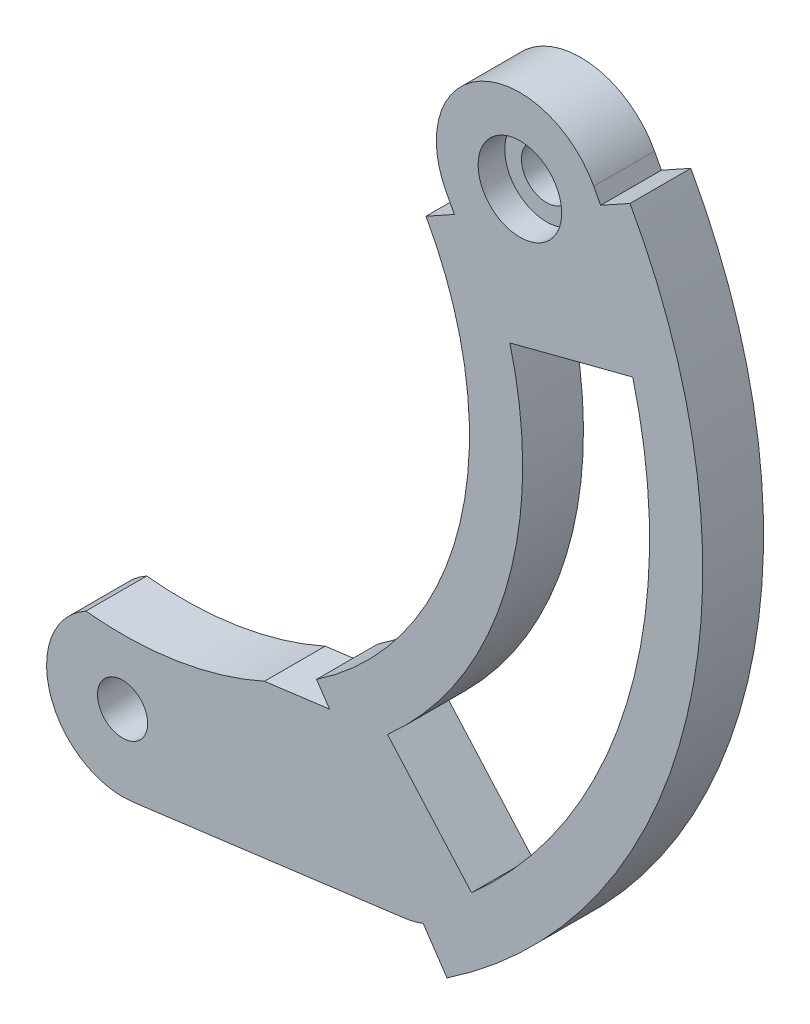
ISO-10303-21;
HEADER;
FILE_DESCRIPTION(('STEP AP214'),'2;1');
FILE_NAME('part.step','',(''),(''),'','','');
FILE_SCHEMA(('AUTOMOTIVE_DESIGN { 1 0 10303 214 1 1 1 1 }'));
ENDSEC;
DATA;
#1=APPLICATION_CONTEXT('core data for automotive mechanical design processes');
#2=APPLICATION_PROTOCOL_DEFINITION('international standard','automotive_design',2000,#1);
#3=PRODUCT_CONTEXT('',#1,'mechanical');
#4=PRODUCT('Part','Part','',(#3));
#5=PRODUCT_RELATED_PRODUCT_CATEGORY('part','',(#4));
#6=PRODUCT_DEFINITION_FORMATION('','',#4);
#7=PRODUCT_DEFINITION_CONTEXT('part definition',#1,'design');
#8=PRODUCT_DEFINITION('design','',#6,#7);
#9=PRODUCT_DEFINITION_SHAPE('','',#8);
#10=(LENGTH_UNIT() NAMED_UNIT(*) SI_UNIT(.MILLI.,.METRE.));
#11=(NAMED_UNIT(*) PLANE_ANGLE_UNIT() SI_UNIT($,.RADIAN.));
#12=(NAMED_UNIT(*) SI_UNIT($,.STERADIAN.) SOLID_ANGLE_UNIT());
#13=UNCERTAINTY_MEASURE_WITH_UNIT(LENGTH_MEASURE(1.E-05),#10,'distance_accuracy_value','');
#14=(GEOMETRIC_REPRESENTATION_CONTEXT(3) GLOBAL_UNCERTAINTY_ASSIGNED_CONTEXT((#13)) GLOBAL_UNIT_ASSIGNED_CONTEXT((#10,
#11,#12)) REPRESENTATION_CONTEXT('',''));
#15=CARTESIAN_POINT('',(0.,0.,0.));
#16=DIRECTION('',(0.,0.,1.));
#17=DIRECTION('',(1.,0.,0.));
#18=AXIS2_PLACEMENT_3D('',#15,#16,#17);
#19=CARTESIAN_POINT('',(52.2872053428289,31.4173225695133,8.1));
#20=DIRECTION('',(0.,0.,-1.));
#21=DIRECTION('',(-1.,0.,0.));
#22=AXIS2_PLACEMENT_3D('',#19,#20,#21);
#23=CYLINDRICAL_SURFACE('',#22,3.3);
#24=CARTESIAN_POINT('',(52.2872053428289,31.4173225695133,1.25));
#25=DIRECTION('',(0.,0.,1.));
#26=DIRECTION('',(1.,0.,0.));
#27=AXIS2_PLACEMENT_3D('',#24,#25,#26);
#28=CIRCLE('',#27,3.3);
#29=CARTESIAN_POINT('',(55.5872053428289,31.4173225695133,1.25));
#30=VERTEX_POINT('',#29);
#31=EDGE_CURVE('E299',#30,#30,#28,.T.);
#32=ORIENTED_EDGE('',*,*,#31,.F.);
#33=EDGE_LOOP('',(#32));
#34=FACE_BOUND('',#33,.T.);
#35=CARTESIAN_POINT('',(52.2872053428289,31.4173225695133,4.5));
#36=DIRECTION('',(0.,0.,1.));
#37=DIRECTION('',(1.,0.,0.));
#38=AXIS2_PLACEMENT_3D('',#35,#36,#37);
#39=CIRCLE('',#38,3.3);
#40=CARTESIAN_POINT('',(55.5872053428289,31.4173225695133,4.5));
#41=VERTEX_POINT('',#40);
#42=EDGE_CURVE('E303',#41,#41,#39,.T.);
#43=ORIENTED_EDGE('',*,*,#42,.T.);
#44=EDGE_LOOP('',(#43));
#45=FACE_BOUND('',#44,.T.);
#46=ADVANCED_FACE('F39',(#34,#45),#23,.F.);
#47=CARTESIAN_POINT('',(0.,0.,8.));
#48=DIRECTION('',(0.,0.,-1.));
#49=DIRECTION('',(-1.,0.,0.));
#50=AXIS2_PLACEMENT_3D('',#47,#48,#49);
#51=PLANE('',#50);
#52=CARTESIAN_POINT('',(52.2872053428289,31.4173225695133,8.));
#53=DIRECTION('',(0.,0.,-1.));
#54=DIRECTION('',(-1.,0.,0.));
#55=AXIS2_PLACEMENT_3D('',#52,#53,#54);
#56=CIRCLE('',#55,5.5);
#57=CARTESIAN_POINT('',(46.7872053428289,31.4173225695133,8.));
#58=VERTEX_POINT('',#57);
#59=EDGE_CURVE('E305',#58,#58,#56,.F.);
#60=ORIENTED_EDGE('',*,*,#59,.F.);
#61=EDGE_LOOP('',(#60));
#62=FACE_BOUND('',#61,.T.);
#63=CARTESIAN_POINT('',(0.,-54.,8.));
#64=DIRECTION('',(0.,0.,-1.));
#65=DIRECTION('',(-1.,0.,0.));
#66=AXIS2_PLACEMENT_3D('',#63,#64,#65);
#67=CIRCLE('',#66,3.3);
#68=CARTESIAN_POINT('',(-3.3,-54.,8.));
#69=VERTEX_POINT('',#68);
#70=EDGE_CURVE('E180',#69,#69,#67,.F.);
#71=ORIENTED_EDGE('',*,*,#70,.F.);
#72=EDGE_LOOP('',(#71));
#73=FACE_BOUND('',#72,.T.);
#74=CARTESIAN_POINT('',(0.,0.,8.));
#75=DIRECTION('',(0.,0.,-1.));
#76=DIRECTION('',(-1.,0.,0.));
#77=AXIS2_PLACEMENT_3D('',#74,#75,#76);
#78=CIRCLE('',#77,45.5);
#79=CARTESIAN_POINT('',(-4.82865654161834,-45.2430555555556,8.));
#80=VERTEX_POINT('',#79);
#81=CARTESIAN_POINT('',(18.6642896870166,-41.4957141218118,8.));
#82=VERTEX_POINT('',#81);
#83=EDGE_CURVE('E184',#80,#82,#78,.F.);
#84=ORIENTED_EDGE('',*,*,#83,.F.);
#85=CARTESIAN_POINT('',(0.,-54.,8.));
#86=DIRECTION('',(0.,0.,1.));
#87=DIRECTION('',(-1.,0.,0.));
#88=AXIS2_PLACEMENT_3D('',#85,#86,#87);
#89=CIRCLE('',#88,10.);
#90=CARTESIAN_POINT('',(1.28611311610923,-63.9169507940986,8.));
#91=VERTEX_POINT('',#90);
#92=EDGE_CURVE('E216',#80,#91,#89,.T.);
#93=ORIENTED_EDGE('',*,*,#92,.T.);
#94=DIRECTION('',(0.991695079409855,0.128611311610923,0.));
#95=VECTOR('',#94,1.);
#96=CARTESIAN_POINT('',(37.1410135059501,-59.2669874509703,8.));
#97=LINE('',#96,#95);
#98=CARTESIAN_POINT('',(37.1410135059501,-59.2669874509703,8.));
#99=VERTEX_POINT('',#98);
#100=EDGE_CURVE('E224',#91,#99,#97,.T.);
#101=ORIENTED_EDGE('',*,*,#100,.T.);
#102=CARTESIAN_POINT('',(35.8549003898409,-49.3500366568718,8.));
#103=DIRECTION('',(0.,0.,1.));
#104=DIRECTION('',(-1.,0.,0.));
#105=AXIS2_PLACEMENT_3D('',#102,#103,#104);
#106=CIRCLE('',#105,10.);
#107=CARTESIAN_POINT('',(39.5537321156996,-58.640819393745,8.));
#108=VERTEX_POINT('',#107);
#109=EDGE_CURVE('E223',#99,#108,#106,.T.);
#110=ORIENTED_EDGE('',*,*,#109,.T.);
#111=DIRECTION('',(0.559192903470747,-0.829037572555042,0.));
#112=VECTOR('',#111,1.);
#113=CARTESIAN_POINT('',(25.5271560434396,-37.8455651871377,8.));
#114=LINE('',#113,#112);
#115=CARTESIAN_POINT('',(42.6943781799915,-63.2970186645774,8.));
#116=VERTEX_POINT('',#115);
#117=EDGE_CURVE('E253',#108,#116,#114,.T.);
#118=ORIENTED_EDGE('',*,*,#117,.T.);
#119=CARTESIAN_POINT('',(0.,0.,8.));
#120=DIRECTION('',(0.,0.,1.));
#121=DIRECTION('',(1.,0.,0.));
#122=AXIS2_PLACEMENT_3D('',#119,#120,#121);
#123=CIRCLE('',#122,76.35);
#124=CARTESIAN_POINT('',(66.7772146400928,37.0152145058079,8.));
#125=VERTEX_POINT('',#124);
#126=EDGE_CURVE('E256',#116,#125,#123,.T.);
#127=ORIENTED_EDGE('',*,*,#126,.T.);
#128=DIRECTION('',(-0.874619707139396,-0.484809620246337,0.));
#129=VECTOR('',#128,1.);
#130=CARTESIAN_POINT('',(66.7772146400929,37.0152145058078,8.));
#131=LINE('',#130,#129);
#132=CARTESIAN_POINT('',(62.9090834815502,34.8710743924211,8.));
#133=VERTEX_POINT('',#132);
#134=EDGE_CURVE('E262',#125,#133,#131,.T.);
#135=ORIENTED_EDGE('',*,*,#134,.T.);
#136=DIRECTION('',(-0.46947156278589,0.882947592858927,0.));
#137=VECTOR('',#136,1.);
#138=CARTESIAN_POINT('',(61.9996288642771,36.5815097601581,8.));
#139=LINE('',#138,#137);
#140=CARTESIAN_POINT('',(61.9996288642771,36.5815097601581,8.));
#141=VERTEX_POINT('',#140);
#142=EDGE_CURVE('E195',#133,#141,#139,.T.);
#143=ORIENTED_EDGE('',*,*,#142,.T.);
#144=CARTESIAN_POINT('',(52.2872053428289,31.4173225695133,8.));
#145=DIRECTION('',(0.,0.,1.));
#146=DIRECTION('',(-1.,0.,0.));
#147=AXIS2_PLACEMENT_3D('',#144,#145,#146);
#148=CIRCLE('',#147,11.);
#149=CARTESIAN_POINT('',(42.5747818213807,26.2531353788685,8.));
#150=VERTEX_POINT('',#149);
#151=EDGE_CURVE('E198',#141,#150,#148,.T.);
#152=ORIENTED_EDGE('',*,*,#151,.T.);
#153=DIRECTION('',(0.46947156278589,-0.882947592858927,0.));
#154=VECTOR('',#153,1.);
#155=CARTESIAN_POINT('',(45.5723514877874,20.6155267755379,8.));
#156=LINE('',#155,#154);
#157=CARTESIAN_POINT('',(43.6645188840821,24.2036380447771,8.));
#158=VERTEX_POINT('',#157);
#159=EDGE_CURVE('E200',#150,#158,#156,.T.);
#160=ORIENTED_EDGE('',*,*,#159,.T.);
#161=CARTESIAN_POINT('',(39.9263896309134,22.1315591642453,8.));
#162=VERTEX_POINT('',#161);
#163=EDGE_CURVE('E264',#158,#162,#131,.T.);
#164=ORIENTED_EDGE('',*,*,#163,.T.);
#165=CARTESIAN_POINT('',(0.,0.,8.));
#166=DIRECTION('',(0.,0.,-1.));
#167=DIRECTION('',(-1.,0.,0.));
#168=AXIS2_PLACEMENT_3D('',#165,#166,#167);
#169=CIRCLE('',#168,45.65);
#170=CARTESIAN_POINT('',(25.5271560434396,-37.8455651871377,8.));
#171=VERTEX_POINT('',#170);
#172=EDGE_CURVE('E255',#162,#171,#169,.T.);
#173=ORIENTED_EDGE('',*,*,#172,.T.);
#174=CARTESIAN_POINT('',(27.2391214175466,-40.383658230234,8.));
#175=VERTEX_POINT('',#174);
#176=EDGE_CURVE('E259',#171,#175,#114,.T.);
#177=ORIENTED_EDGE('',*,*,#176,.T.);
#178=DIRECTION('',(-0.991695079409855,-0.128611311610923,0.));
#179=VECTOR('',#178,1.);
#180=CARTESIAN_POINT('',(-1.28611311610923,-44.0830492059015,8.));
#181=LINE('',#180,#179);
#182=EDGE_CURVE('E226',#175,#82,#181,.T.);
#183=ORIENTED_EDGE('',*,*,#182,.T.);
#184=EDGE_LOOP('',(#84,#93,#101,#110,#118,#127,#135,#143,#152,#160,#164,#173,#177,#183));
#185=FACE_BOUND('',#184,.T.);
#186=CARTESIAN_POINT('',(0.,0.,8.));
#187=DIRECTION('',(0.,0.,-1.));
#188=DIRECTION('',(-1.,0.,0.));
#189=AXIS2_PLACEMENT_3D('',#186,#187,#188);
#190=CIRCLE('',#189,52.6499999999999);
#191=CARTESIAN_POINT('',(50.9647013001965,13.2144512327131,8.));
#192=VERTEX_POINT('',#191);
#193=CARTESIAN_POINT('',(34.8622248993142,-39.4543758671916,8.));
#194=VERTEX_POINT('',#193);
#195=EDGE_CURVE('E172',#192,#194,#190,.T.);
#196=ORIENTED_EDGE('',*,*,#195,.F.);
#197=DIRECTION('',(-0.967990528018926,-0.250986728066725,0.));
#198=VECTOR('',#197,1.);
#199=CARTESIAN_POINT('',(0.,0.,8.));
#200=LINE('',#199,#198);
#201=CARTESIAN_POINT('',(67.1301431181125,17.4059295914274,8.));
#202=VERTEX_POINT('',#201);
#203=EDGE_CURVE('E161',#202,#192,#200,.T.);
#204=ORIENTED_EDGE('',*,*,#203,.F.);
#205=CARTESIAN_POINT('',(0.,0.,8.));
#206=DIRECTION('',(0.,0.,-1.));
#207=DIRECTION('',(-1.,0.,0.));
#208=AXIS2_PLACEMENT_3D('',#205,#206,#207);
#209=CIRCLE('',#208,69.3499999999999);
#210=CARTESIAN_POINT('',(45.9201385900749,-51.9688692571651,8.));
#211=VERTEX_POINT('',#210);
#212=EDGE_CURVE('E166',#211,#202,#209,.F.);
#213=ORIENTED_EDGE('',*,*,#212,.F.);
#214=DIRECTION('',(0.662150520404829,-0.749370861675055,0.));
#215=VECTOR('',#214,1.);
#216=CARTESIAN_POINT('',(0.,0.,8.));
#217=LINE('',#216,#215);
#218=EDGE_CURVE('E181',#194,#211,#217,.T.);
#219=ORIENTED_EDGE('',*,*,#218,.F.);
#220=EDGE_LOOP('',(#196,#204,#213,#219));
#221=FACE_BOUND('',#220,.T.);
#222=ADVANCED_FACE('F179',(#62,#73,#185,#221),#51,.F.);
#223=CARTESIAN_POINT('',(0.,0.,0.));
#224=DIRECTION('',(0.,0.,-1.));
#225=DIRECTION('',(-1.,0.,0.));
#226=AXIS2_PLACEMENT_3D('',#223,#224,#225);
#227=PLANE('',#226);
#228=CARTESIAN_POINT('',(52.2872053458,31.4173225695,0.));
#229=DIRECTION('',(0.,0.,-1.));
#230=DIRECTION('',(-1.,0.,0.));
#231=AXIS2_PLACEMENT_3D('',#228,#229,#230);
#232=CIRCLE('',#231,8.15);
#233=CARTESIAN_POINT('',(44.1372053458,31.4173225695,0.));
#234=VERTEX_POINT('',#233);
#235=EDGE_CURVE('E43',#234,#234,#232,.F.);
#236=ORIENTED_EDGE('',*,*,#235,.T.);
#237=EDGE_LOOP('',(#236));
#238=FACE_BOUND('',#237,.T.);
#239=CARTESIAN_POINT('',(0.,-54.,0.));
#240=DIRECTION('',(0.,0.,-1.));
#241=DIRECTION('',(-1.,0.,0.));
#242=AXIS2_PLACEMENT_3D('',#239,#240,#241);
#243=CIRCLE('',#242,3.3);
#244=CARTESIAN_POINT('',(-3.3,-54.,0.));
#245=VERTEX_POINT('',#244);
#246=EDGE_CURVE('E298',#245,#245,#243,.F.);
#247=ORIENTED_EDGE('',*,*,#246,.T.);
#248=EDGE_LOOP('',(#247));
#249=FACE_BOUND('',#248,.T.);
#250=CARTESIAN_POINT('',(0.,-54.,0.));
#251=DIRECTION('',(0.,0.,1.));
#252=DIRECTION('',(-1.,0.,0.));
#253=AXIS2_PLACEMENT_3D('',#250,#251,#252);
#254=CIRCLE('',#253,10.);
#255=CARTESIAN_POINT('',(-4.82865654161834,-45.2430555555556,0.));
#256=VERTEX_POINT('',#255);
#257=CARTESIAN_POINT('',(1.28611311610923,-63.9169507940986,0.));
#258=VERTEX_POINT('',#257);
#259=EDGE_CURVE('E220',#256,#258,#254,.T.);
#260=ORIENTED_EDGE('',*,*,#259,.F.);
#261=CARTESIAN_POINT('',(0.,0.,0.));
#262=DIRECTION('',(0.,0.,-1.));
#263=DIRECTION('',(-1.,0.,0.));
#264=AXIS2_PLACEMENT_3D('',#261,#262,#263);
#265=CIRCLE('',#264,45.5);
#266=CARTESIAN_POINT('',(18.6642896870166,-41.4957141218118,0.));
#267=VERTEX_POINT('',#266);
#268=EDGE_CURVE('E185',#256,#267,#265,.F.);
#269=ORIENTED_EDGE('',*,*,#268,.T.);
#270=DIRECTION('',(-0.991695079409855,-0.128611311610923,0.));
#271=VECTOR('',#270,1.);
#272=CARTESIAN_POINT('',(-1.28611311610923,-44.0830492059015,0.));
#273=LINE('',#272,#271);
#274=CARTESIAN_POINT('',(27.2391214175466,-40.383658230234,0.));
#275=VERTEX_POINT('',#274);
#276=EDGE_CURVE('E225',#275,#267,#273,.T.);
#277=ORIENTED_EDGE('',*,*,#276,.F.);
#278=DIRECTION('',(0.559192903470747,-0.829037572555042,0.));
#279=VECTOR('',#278,1.);
#280=CARTESIAN_POINT('',(25.5271560434396,-37.8455651871377,0.));
#281=LINE('',#280,#279);
#282=CARTESIAN_POINT('',(25.5271560434396,-37.8455651871377,0.));
#283=VERTEX_POINT('',#282);
#284=EDGE_CURVE('E268',#283,#275,#281,.T.);
#285=ORIENTED_EDGE('',*,*,#284,.F.);
#286=CARTESIAN_POINT('',(0.,0.,0.));
#287=DIRECTION('',(0.,0.,-1.));
#288=DIRECTION('',(-1.,0.,0.));
#289=AXIS2_PLACEMENT_3D('',#286,#287,#288);
#290=CIRCLE('',#289,45.65);
#291=CARTESIAN_POINT('',(39.9263896309134,22.1315591642453,0.));
#292=VERTEX_POINT('',#291);
#293=EDGE_CURVE('E252',#292,#283,#290,.T.);
#294=ORIENTED_EDGE('',*,*,#293,.F.);
#295=DIRECTION('',(-0.874619707139396,-0.484809620246337,0.));
#296=VECTOR('',#295,1.);
#297=CARTESIAN_POINT('',(66.7772146400929,37.0152145058078,0.));
#298=LINE('',#297,#296);
#299=CARTESIAN_POINT('',(43.6645188840821,24.2036380447771,0.));
#300=VERTEX_POINT('',#299);
#301=EDGE_CURVE('E274',#300,#292,#298,.T.);
#302=ORIENTED_EDGE('',*,*,#301,.F.);
#303=DIRECTION('',(0.46947156278589,-0.882947592858927,0.));
#304=VECTOR('',#303,1.);
#305=CARTESIAN_POINT('',(45.5723514877874,20.6155267755379,0.));
#306=LINE('',#305,#304);
#307=CARTESIAN_POINT('',(42.5747818213807,26.2531353788685,0.));
#308=VERTEX_POINT('',#307);
#309=EDGE_CURVE('E199',#308,#300,#306,.T.);
#310=ORIENTED_EDGE('',*,*,#309,.F.);
#311=CARTESIAN_POINT('',(52.2872053428289,31.4173225695133,0.));
#312=DIRECTION('',(0.,0.,1.));
#313=DIRECTION('',(-1.,0.,0.));
#314=AXIS2_PLACEMENT_3D('',#311,#312,#313);
#315=CIRCLE('',#314,11.);
#316=CARTESIAN_POINT('',(61.9996288642771,36.5815097601581,0.));
#317=VERTEX_POINT('',#316);
#318=EDGE_CURVE('E201',#317,#308,#315,.T.);
#319=ORIENTED_EDGE('',*,*,#318,.F.);
#320=DIRECTION('',(-0.46947156278589,0.882947592858927,0.));
#321=VECTOR('',#320,1.);
#322=CARTESIAN_POINT('',(61.9996288642771,36.5815097601581,0.));
#323=LINE('',#322,#321);
#324=CARTESIAN_POINT('',(62.9090834815502,34.8710743924211,0.));
#325=VERTEX_POINT('',#324);
#326=EDGE_CURVE('E192',#325,#317,#323,.T.);
#327=ORIENTED_EDGE('',*,*,#326,.F.);
#328=CARTESIAN_POINT('',(66.7772146400928,37.0152145058079,0.));
#329=VERTEX_POINT('',#328);
#330=EDGE_CURVE('E258',#329,#325,#298,.T.);
#331=ORIENTED_EDGE('',*,*,#330,.F.);
#332=CARTESIAN_POINT('',(0.,0.,0.));
#333=DIRECTION('',(0.,0.,1.));
#334=DIRECTION('',(1.,0.,0.));
#335=AXIS2_PLACEMENT_3D('',#332,#333,#334);
#336=CIRCLE('',#335,76.35);
#337=CARTESIAN_POINT('',(42.6943781799915,-63.2970186645774,0.));
#338=VERTEX_POINT('',#337);
#339=EDGE_CURVE('E275',#338,#329,#336,.T.);
#340=ORIENTED_EDGE('',*,*,#339,.F.);
#341=CARTESIAN_POINT('',(39.5537321156996,-58.640819393745,0.));
#342=VERTEX_POINT('',#341);
#343=EDGE_CURVE('E266',#342,#338,#281,.T.);
#344=ORIENTED_EDGE('',*,*,#343,.F.);
#345=CARTESIAN_POINT('',(35.8549003898409,-49.3500366568718,0.));
#346=DIRECTION('',(0.,0.,1.));
#347=DIRECTION('',(-1.,0.,0.));
#348=AXIS2_PLACEMENT_3D('',#345,#346,#347);
#349=CIRCLE('',#348,10.);
#350=CARTESIAN_POINT('',(37.1410135059501,-59.2669874509703,0.));
#351=VERTEX_POINT('',#350);
#352=EDGE_CURVE('E232',#351,#342,#349,.T.);
#353=ORIENTED_EDGE('',*,*,#352,.F.);
#354=DIRECTION('',(0.991695079409855,0.128611311610923,0.));
#355=VECTOR('',#354,1.);
#356=CARTESIAN_POINT('',(37.1410135059501,-59.2669874509703,0.));
#357=LINE('',#356,#355);
#358=EDGE_CURVE('E231',#258,#351,#357,.T.);
#359=ORIENTED_EDGE('',*,*,#358,.F.);
#360=EDGE_LOOP('',(#260,#269,#277,#285,#294,#302,#310,#319,#327,#331,#340,#344,#353,#359));
#361=FACE_BOUND('',#360,.T.);
#362=DIRECTION('',(-0.967990528018926,-0.250986728066725,0.));
#363=VECTOR('',#362,1.);
#364=CARTESIAN_POINT('',(0.,0.,0.));
#365=LINE('',#364,#363);
#366=CARTESIAN_POINT('',(67.1301431181125,17.4059295914274,0.));
#367=VERTEX_POINT('',#366);
#368=CARTESIAN_POINT('',(50.9647013001965,13.2144512327131,0.));
#369=VERTEX_POINT('',#368);
#370=EDGE_CURVE('E286',#367,#369,#365,.T.);
#371=ORIENTED_EDGE('',*,*,#370,.T.);
#372=CARTESIAN_POINT('',(0.,0.,0.));
#373=DIRECTION('',(0.,0.,-1.));
#374=DIRECTION('',(-1.,0.,0.));
#375=AXIS2_PLACEMENT_3D('',#372,#373,#374);
#376=CIRCLE('',#375,52.6499999999999);
#377=CARTESIAN_POINT('',(34.8622248993142,-39.4543758671916,0.));
#378=VERTEX_POINT('',#377);
#379=EDGE_CURVE('E11',#369,#378,#376,.T.);
#380=ORIENTED_EDGE('',*,*,#379,.T.);
#381=DIRECTION('',(0.662150520404829,-0.749370861675055,0.));
#382=VECTOR('',#381,1.);
#383=CARTESIAN_POINT('',(0.,0.,0.));
#384=LINE('',#383,#382);
#385=CARTESIAN_POINT('',(45.9201385900749,-51.9688692571651,0.));
#386=VERTEX_POINT('',#385);
#387=EDGE_CURVE('E48',#378,#386,#384,.T.);
#388=ORIENTED_EDGE('',*,*,#387,.T.);
#389=CARTESIAN_POINT('',(0.,0.,0.));
#390=DIRECTION('',(0.,0.,-1.));
#391=DIRECTION('',(-1.,0.,0.));
#392=AXIS2_PLACEMENT_3D('',#389,#390,#391);
#393=CIRCLE('',#392,69.3499999999999);
#394=EDGE_CURVE('E293',#386,#367,#393,.F.);
#395=ORIENTED_EDGE('',*,*,#394,.T.);
#396=EDGE_LOOP('',(#371,#380,#388,#395));
#397=FACE_BOUND('',#396,.T.);
#398=ADVANCED_FACE('F312',(#238,#249,#361,#397),#227,.T.);
#399=CARTESIAN_POINT('',(-1.28611311610923,-44.0830492059015,8.));
#400=DIRECTION('',(0.128611311610923,-0.991695079409855,0.));
#401=DIRECTION('',(0.991695079409855,0.128611311610923,0.));
#402=AXIS2_PLACEMENT_3D('',#399,#400,#401);
#403=PLANE('',#402);
#404=DIRECTION('',(0.,0.,-1.));
#405=VECTOR('',#404,1.);
#406=CARTESIAN_POINT('',(18.6642896870166,-41.4957141218118,8.1));
#407=LINE('',#406,#405);
#408=EDGE_CURVE('E193',#82,#267,#407,.T.);
#409=ORIENTED_EDGE('',*,*,#408,.F.);
#410=ORIENTED_EDGE('',*,*,#182,.F.);
#411=DIRECTION('',(0.,0.,-1.));
#412=VECTOR('',#411,1.);
#413=CARTESIAN_POINT('',(27.2391214175466,-40.383658230234,8.));
#414=LINE('',#413,#412);
#415=EDGE_CURVE('E244',#175,#275,#414,.T.);
#416=ORIENTED_EDGE('',*,*,#415,.T.);
#417=ORIENTED_EDGE('',*,*,#276,.T.);
#418=EDGE_LOOP('',(#409,#410,#416,#417));
#419=FACE_BOUND('',#418,.T.);
#420=ADVANCED_FACE('F380',(#419),#403,.F.);
#421=CARTESIAN_POINT('',(0.,-54.,8.));
#422=DIRECTION('',(0.,0.,-1.));
#423=DIRECTION('',(-1.,0.,0.));
#424=AXIS2_PLACEMENT_3D('',#421,#422,#423);
#425=CYLINDRICAL_SURFACE('',#424,10.);
#426=DIRECTION('',(0.,0.,-1.));
#427=VECTOR('',#426,1.);
#428=CARTESIAN_POINT('',(-4.82865654161834,-45.2430555555556,4.));
#429=LINE('',#428,#427);
#430=EDGE_CURVE('E289',#256,#80,#429,.F.);
#431=ORIENTED_EDGE('',*,*,#430,.F.);
#432=ORIENTED_EDGE('',*,*,#259,.T.);
#433=DIRECTION('',(0.,0.,-1.));
#434=VECTOR('',#433,1.);
#435=CARTESIAN_POINT('',(1.28611311610923,-63.9169507940986,8.));
#436=LINE('',#435,#434);
#437=EDGE_CURVE('E245',#91,#258,#436,.T.);
#438=ORIENTED_EDGE('',*,*,#437,.F.);
#439=ORIENTED_EDGE('',*,*,#92,.F.);
#440=EDGE_LOOP('',(#431,#432,#438,#439));
#441=FACE_BOUND('',#440,.T.);
#442=ADVANCED_FACE('F329',(#441),#425,.T.);
#443=CARTESIAN_POINT('',(66.7772146400929,37.0152145058078,8.));
#444=DIRECTION('',(0.484809620246337,-0.874619707139396,0.));
#445=DIRECTION('',(0.874619707139396,0.484809620246337,0.));
#446=AXIS2_PLACEMENT_3D('',#443,#444,#445);
#447=PLANE('',#446);
#448=DIRECTION('',(0.,0.,-1.));
#449=VECTOR('',#448,1.);
#450=CARTESIAN_POINT('',(62.9090834815502,34.8710743924211,8.));
#451=LINE('',#450,#449);
#452=EDGE_CURVE('E218',#133,#325,#451,.T.);
#453=ORIENTED_EDGE('',*,*,#452,.F.);
#454=ORIENTED_EDGE('',*,*,#134,.F.);
#455=DIRECTION('',(0.,0.,-1.));
#456=VECTOR('',#455,1.);
#457=CARTESIAN_POINT('',(66.7772146400928,37.0152145058079,8.));
#458=LINE('',#457,#456);
#459=EDGE_CURVE('E277',#125,#329,#458,.T.);
#460=ORIENTED_EDGE('',*,*,#459,.T.);
#461=ORIENTED_EDGE('',*,*,#330,.T.);
#462=EDGE_LOOP('',(#453,#454,#460,#461));
#463=FACE_BOUND('',#462,.T.);
#464=ADVANCED_FACE('F354',(#463),#447,.F.);
#465=DIRECTION('',(0.,0.,1.));
#466=VECTOR('',#465,1.);
#467=CARTESIAN_POINT('',(43.6645188840821,24.2036380447771,8.));
#468=LINE('',#467,#466);
#469=EDGE_CURVE('E212',#300,#158,#468,.T.);
#470=ORIENTED_EDGE('',*,*,#469,.F.);
#471=ORIENTED_EDGE('',*,*,#301,.T.);
#472=DIRECTION('',(0.,0.,-1.));
#473=VECTOR('',#472,1.);
#474=CARTESIAN_POINT('',(39.9263896309134,22.1315591642453,8.));
#475=LINE('',#474,#473);
#476=EDGE_CURVE('E267',#162,#292,#475,.T.);
#477=ORIENTED_EDGE('',*,*,#476,.F.);
#478=ORIENTED_EDGE('',*,*,#163,.F.);
#479=EDGE_LOOP('',(#470,#471,#477,#478));
#480=FACE_BOUND('',#479,.T.);
#481=ADVANCED_FACE('F367',(#480),#447,.F.);
#482=CARTESIAN_POINT('',(25.5271560434396,-37.8455651871377,8.));
#483=DIRECTION('',(0.829037572555042,0.559192903470747,0.));
#484=DIRECTION('',(-0.559192903470747,0.829037572555042,0.));
#485=AXIS2_PLACEMENT_3D('',#482,#483,#484);
#486=PLANE('',#485);
#487=DIRECTION('',(0.,0.,-1.));
#488=VECTOR('',#487,1.);
#489=CARTESIAN_POINT('',(39.5537321156996,-58.640819393745,8.));
#490=LINE('',#489,#488);
#491=EDGE_CURVE('E247',#342,#108,#490,.F.);
#492=ORIENTED_EDGE('',*,*,#491,.F.);
#493=ORIENTED_EDGE('',*,*,#343,.T.);
#494=DIRECTION('',(0.,0.,-1.));
#495=VECTOR('',#494,1.);
#496=CARTESIAN_POINT('',(42.6943781799915,-63.2970186645774,8.));
#497=LINE('',#496,#495);
#498=EDGE_CURVE('E283',#116,#338,#497,.T.);
#499=ORIENTED_EDGE('',*,*,#498,.F.);
#500=ORIENTED_EDGE('',*,*,#117,.F.);
#501=EDGE_LOOP('',(#492,#493,#499,#500));
#502=FACE_BOUND('',#501,.T.);
#503=ADVANCED_FACE('F338',(#502),#486,.F.);
#504=ORIENTED_EDGE('',*,*,#415,.F.);
#505=ORIENTED_EDGE('',*,*,#176,.F.);
#506=DIRECTION('',(0.,0.,-1.));
#507=VECTOR('',#506,1.);
#508=CARTESIAN_POINT('',(25.5271560434396,-37.8455651871377,8.));
#509=LINE('',#508,#507);
#510=EDGE_CURVE('E285',#171,#283,#509,.T.);
#511=ORIENTED_EDGE('',*,*,#510,.T.);
#512=ORIENTED_EDGE('',*,*,#284,.T.);
#513=EDGE_LOOP('',(#504,#505,#511,#512));
#514=FACE_BOUND('',#513,.T.);
#515=ADVANCED_FACE('F467',(#514),#486,.F.);
#516=CARTESIAN_POINT('',(0.,0.,8.));
#517=DIRECTION('',(0.,0.,-1.));
#518=DIRECTION('',(-1.,0.,0.));
#519=AXIS2_PLACEMENT_3D('',#516,#517,#518);
#520=CYLINDRICAL_SURFACE('',#519,45.65);
#521=ORIENTED_EDGE('',*,*,#293,.T.);
#522=ORIENTED_EDGE('',*,*,#510,.F.);
#523=ORIENTED_EDGE('',*,*,#172,.F.);
#524=ORIENTED_EDGE('',*,*,#476,.T.);
#525=EDGE_LOOP('',(#521,#522,#523,#524));
#526=FACE_BOUND('',#525,.T.);
#527=ADVANCED_FACE('F41',(#526),#520,.F.);
#528=CARTESIAN_POINT('',(0.,0.,8.));
#529=DIRECTION('',(0.,0.,-1.));
#530=DIRECTION('',(-1.,0.,0.));
#531=AXIS2_PLACEMENT_3D('',#528,#529,#530);
#532=CYLINDRICAL_SURFACE('',#531,76.35);
#533=ORIENTED_EDGE('',*,*,#339,.T.);
#534=ORIENTED_EDGE('',*,*,#459,.F.);
#535=ORIENTED_EDGE('',*,*,#126,.F.);
#536=ORIENTED_EDGE('',*,*,#498,.T.);
#537=EDGE_LOOP('',(#533,#534,#535,#536));
#538=FACE_BOUND('',#537,.T.);
#539=ADVANCED_FACE('F347',(#538),#532,.T.);
#540=CARTESIAN_POINT('',(35.8549003898409,-49.3500366568718,8.));
#541=DIRECTION('',(0.,0.,-1.));
#542=DIRECTION('',(-1.,0.,0.));
#543=AXIS2_PLACEMENT_3D('',#540,#541,#542);
#544=CYLINDRICAL_SURFACE('',#543,10.);
#545=ORIENTED_EDGE('',*,*,#352,.T.);
#546=ORIENTED_EDGE('',*,*,#491,.T.);
#547=ORIENTED_EDGE('',*,*,#109,.F.);
#548=DIRECTION('',(0.,0.,-1.));
#549=VECTOR('',#548,1.);
#550=CARTESIAN_POINT('',(37.1410135059501,-59.2669874509703,8.));
#551=LINE('',#550,#549);
#552=EDGE_CURVE('E233',#99,#351,#551,.T.);
#553=ORIENTED_EDGE('',*,*,#552,.T.);
#554=EDGE_LOOP('',(#545,#546,#547,#553));
#555=FACE_BOUND('',#554,.T.);
#556=ADVANCED_FACE('F337',(#555),#544,.T.);
#557=CARTESIAN_POINT('',(37.1410135059501,-59.2669874509703,8.));
#558=DIRECTION('',(-0.128611311610923,0.991695079409855,0.));
#559=DIRECTION('',(-0.991695079409855,-0.128611311610923,0.));
#560=AXIS2_PLACEMENT_3D('',#557,#558,#559);
#561=PLANE('',#560);
#562=ORIENTED_EDGE('',*,*,#358,.T.);
#563=ORIENTED_EDGE('',*,*,#552,.F.);
#564=ORIENTED_EDGE('',*,*,#100,.F.);
#565=ORIENTED_EDGE('',*,*,#437,.T.);
#566=EDGE_LOOP('',(#562,#563,#564,#565));
#567=FACE_BOUND('',#566,.T.);
#568=ADVANCED_FACE('F332',(#567),#561,.F.);
#569=CARTESIAN_POINT('',(61.9996288642771,36.5815097601581,8.));
#570=DIRECTION('',(-0.882947592858927,-0.46947156278589,0.));
#571=DIRECTION('',(0.46947156278589,-0.882947592858927,0.));
#572=AXIS2_PLACEMENT_3D('',#569,#570,#571);
#573=PLANE('',#572);
#574=ORIENTED_EDGE('',*,*,#142,.F.);
#575=ORIENTED_EDGE('',*,*,#452,.T.);
#576=ORIENTED_EDGE('',*,*,#326,.T.);
#577=DIRECTION('',(0.,0.,-1.));
#578=VECTOR('',#577,1.);
#579=CARTESIAN_POINT('',(61.9996288642771,36.5815097601581,8.));
#580=LINE('',#579,#578);
#581=EDGE_CURVE('E208',#141,#317,#580,.T.);
#582=ORIENTED_EDGE('',*,*,#581,.F.);
#583=EDGE_LOOP('',(#574,#575,#576,#582));
#584=FACE_BOUND('',#583,.T.);
#585=ADVANCED_FACE('F358',(#584),#573,.F.);
#586=CARTESIAN_POINT('',(45.5723514877874,20.6155267755379,8.));
#587=DIRECTION('',(0.882947592858927,0.46947156278589,0.));
#588=DIRECTION('',(-0.46947156278589,0.882947592858927,0.));
#589=AXIS2_PLACEMENT_3D('',#586,#587,#588);
#590=PLANE('',#589);
#591=ORIENTED_EDGE('',*,*,#309,.T.);
#592=ORIENTED_EDGE('',*,*,#469,.T.);
#593=ORIENTED_EDGE('',*,*,#159,.F.);
#594=DIRECTION('',(0.,0.,-1.));
#595=VECTOR('',#594,1.);
#596=CARTESIAN_POINT('',(42.5747818213807,26.2531353788685,8.));
#597=LINE('',#596,#595);
#598=EDGE_CURVE('E204',#150,#308,#597,.T.);
#599=ORIENTED_EDGE('',*,*,#598,.T.);
#600=EDGE_LOOP('',(#591,#592,#593,#599));
#601=FACE_BOUND('',#600,.T.);
#602=ADVANCED_FACE('F362',(#601),#590,.F.);
#603=CARTESIAN_POINT('',(52.2872053428289,31.4173225695133,8.));
#604=DIRECTION('',(0.,0.,-1.));
#605=DIRECTION('',(-1.,0.,0.));
#606=AXIS2_PLACEMENT_3D('',#603,#604,#605);
#607=CYLINDRICAL_SURFACE('',#606,11.);
#608=ORIENTED_EDGE('',*,*,#318,.T.);
#609=ORIENTED_EDGE('',*,*,#598,.F.);
#610=ORIENTED_EDGE('',*,*,#151,.F.);
#611=ORIENTED_EDGE('',*,*,#581,.T.);
#612=EDGE_LOOP('',(#608,#609,#610,#611));
#613=FACE_BOUND('',#612,.T.);
#614=ADVANCED_FACE('F363',(#613),#607,.T.);
#615=CARTESIAN_POINT('',(0.,0.,8.1));
#616=DIRECTION('',(0.,0.,-1.));
#617=DIRECTION('',(-1.,0.,0.));
#618=AXIS2_PLACEMENT_3D('',#615,#616,#617);
#619=CYLINDRICAL_SURFACE('',#618,45.5);
#620=ORIENTED_EDGE('',*,*,#408,.T.);
#621=ORIENTED_EDGE('',*,*,#268,.F.);
#622=ORIENTED_EDGE('',*,*,#430,.T.);
#623=ORIENTED_EDGE('',*,*,#83,.T.);
#624=EDGE_LOOP('',(#620,#621,#622,#623));
#625=FACE_BOUND('',#624,.T.);
#626=ADVANCED_FACE('F377',(#625),#619,.F.);
#627=CARTESIAN_POINT('',(0.,0.,8.1));
#628=DIRECTION('',(0.,0.,-1.));
#629=DIRECTION('',(-1.,0.,0.));
#630=AXIS2_PLACEMENT_3D('',#627,#628,#629);
#631=CYLINDRICAL_SURFACE('',#630,52.6499999999999);
#632=ORIENTED_EDGE('',*,*,#195,.T.);
#633=DIRECTION('',(0.,0.,-1.));
#634=VECTOR('',#633,1.);
#635=CARTESIAN_POINT('',(34.8622248993142,-39.4543758671916,8.1));
#636=LINE('',#635,#634);
#637=EDGE_CURVE('E169',#194,#378,#636,.T.);
#638=ORIENTED_EDGE('',*,*,#637,.T.);
#639=ORIENTED_EDGE('',*,*,#379,.F.);
#640=DIRECTION('',(0.,0.,-1.));
#641=VECTOR('',#640,1.);
#642=CARTESIAN_POINT('',(50.9647013001965,13.2144512327131,8.1));
#643=LINE('',#642,#641);
#644=EDGE_CURVE('E63',#192,#369,#643,.T.);
#645=ORIENTED_EDGE('',*,*,#644,.F.);
#646=EDGE_LOOP('',(#632,#638,#639,#645));
#647=FACE_BOUND('',#646,.T.);
#648=ADVANCED_FACE('F175',(#647),#631,.T.);
#649=CARTESIAN_POINT('',(34.8622248993142,-39.4543758671916,8.1));
#650=DIRECTION('',(0.749370861675055,0.662150520404829,0.));
#651=DIRECTION('',(-0.662150520404829,0.749370861675055,0.));
#652=AXIS2_PLACEMENT_3D('',#649,#650,#651);
#653=PLANE('',#652);
#654=ORIENTED_EDGE('',*,*,#218,.T.);
#655=DIRECTION('',(0.,0.,-1.));
#656=VECTOR('',#655,1.);
#657=CARTESIAN_POINT('',(45.9201385900749,-51.9688692571651,8.1));
#658=LINE('',#657,#656);
#659=EDGE_CURVE('E415',#211,#386,#658,.T.);
#660=ORIENTED_EDGE('',*,*,#659,.T.);
#661=ORIENTED_EDGE('',*,*,#387,.F.);
#662=ORIENTED_EDGE('',*,*,#637,.F.);
#663=EDGE_LOOP('',(#654,#660,#661,#662));
#664=FACE_BOUND('',#663,.T.);
#665=ADVANCED_FACE('F383',(#664),#653,.T.);
#666=CARTESIAN_POINT('',(0.,0.,8.1));
#667=DIRECTION('',(0.,0.,-1.));
#668=DIRECTION('',(-1.,0.,0.));
#669=AXIS2_PLACEMENT_3D('',#666,#667,#668);
#670=CYLINDRICAL_SURFACE('',#669,69.3499999999999);
#671=ORIENTED_EDGE('',*,*,#212,.T.);
#672=DIRECTION('',(0.,0.,-1.));
#673=VECTOR('',#672,1.);
#674=CARTESIAN_POINT('',(67.1301431181125,17.4059295914274,8.1));
#675=LINE('',#674,#673);
#676=EDGE_CURVE('E57',#202,#367,#675,.T.);
#677=ORIENTED_EDGE('',*,*,#676,.T.);
#678=ORIENTED_EDGE('',*,*,#394,.F.);
#679=ORIENTED_EDGE('',*,*,#659,.F.);
#680=EDGE_LOOP('',(#671,#677,#678,#679));
#681=FACE_BOUND('',#680,.T.);
#682=ADVANCED_FACE('F404',(#681),#670,.F.);
#683=CARTESIAN_POINT('',(67.1301431181125,17.4059295914274,8.1));
#684=DIRECTION('',(0.250986728066725,-0.967990528018926,0.));
#685=DIRECTION('',(0.967990528018926,0.250986728066725,0.));
#686=AXIS2_PLACEMENT_3D('',#683,#684,#685);
#687=PLANE('',#686);
#688=ORIENTED_EDGE('',*,*,#203,.T.);
#689=ORIENTED_EDGE('',*,*,#644,.T.);
#690=ORIENTED_EDGE('',*,*,#370,.F.);
#691=ORIENTED_EDGE('',*,*,#676,.F.);
#692=EDGE_LOOP('',(#688,#689,#690,#691));
#693=FACE_BOUND('',#692,.T.);
#694=ADVANCED_FACE('F165',(#693),#687,.T.);
#695=CARTESIAN_POINT('',(0.,-54.,8.1));
#696=DIRECTION('',(0.,0.,-1.));
#697=DIRECTION('',(-1.,0.,0.));
#698=AXIS2_PLACEMENT_3D('',#695,#696,#697);
#699=CYLINDRICAL_SURFACE('',#698,3.3);
#700=ORIENTED_EDGE('',*,*,#246,.F.);
#701=EDGE_LOOP('',(#700));
#702=FACE_BOUND('',#701,.T.);
#703=ORIENTED_EDGE('',*,*,#70,.T.);
#704=EDGE_LOOP('',(#703));
#705=FACE_BOUND('',#704,.T.);
#706=ADVANCED_FACE('F398',(#702,#705),#699,.F.);
#707=CARTESIAN_POINT('',(52.2872053428289,31.4173225695133,1.25));
#708=DIRECTION('',(0.,0.,1.));
#709=DIRECTION('',(1.,0.,0.));
#710=AXIS2_PLACEMENT_3D('',#707,#708,#709);
#711=PLANE('',#710);
#712=ORIENTED_EDGE('',*,*,#31,.T.);
#713=EDGE_LOOP('',(#712));
#714=FACE_BOUND('',#713,.T.);
#715=CARTESIAN_POINT('',(52.2872053458,31.4173225695,1.25));
#716=DIRECTION('',(0.,0.,1.));
#717=DIRECTION('',(1.,0.,0.));
#718=AXIS2_PLACEMENT_3D('',#715,#716,#717);
#719=CIRCLE('',#718,8.15);
#720=CARTESIAN_POINT('',(44.1372053458,31.4173225695,1.25));
#721=VERTEX_POINT('',#720);
#722=EDGE_CURVE('E422',#721,#721,#719,.T.);
#723=ORIENTED_EDGE('',*,*,#722,.F.);
#724=EDGE_LOOP('',(#723));
#725=FACE_BOUND('',#724,.T.);
#726=ADVANCED_FACE('F442',(#714,#725),#711,.F.);
#727=CARTESIAN_POINT('',(52.2872053428289,31.4173225695133,8.1));
#728=DIRECTION('',(0.,0.,-1.));
#729=DIRECTION('',(-1.,0.,0.));
#730=AXIS2_PLACEMENT_3D('',#727,#728,#729);
#731=CYLINDRICAL_SURFACE('',#730,5.5);
#732=CARTESIAN_POINT('',(52.2872053428289,31.4173225695133,4.5));
#733=DIRECTION('',(0.,0.,1.));
#734=DIRECTION('',(1.,0.,0.));
#735=AXIS2_PLACEMENT_3D('',#732,#733,#734);
#736=CIRCLE('',#735,5.5);
#737=CARTESIAN_POINT('',(57.7872053428289,31.4173225695133,4.5));
#738=VERTEX_POINT('',#737);
#739=EDGE_CURVE('E304',#738,#738,#736,.T.);
#740=ORIENTED_EDGE('',*,*,#739,.F.);
#741=EDGE_LOOP('',(#740));
#742=FACE_BOUND('',#741,.T.);
#743=ORIENTED_EDGE('',*,*,#59,.T.);
#744=EDGE_LOOP('',(#743));
#745=FACE_BOUND('',#744,.T.);
#746=ADVANCED_FACE('F307',(#742,#745),#731,.F.);
#747=CARTESIAN_POINT('',(52.2872053428289,31.4173225695133,4.5));
#748=DIRECTION('',(0.,0.,1.));
#749=DIRECTION('',(1.,0.,0.));
#750=AXIS2_PLACEMENT_3D('',#747,#748,#749);
#751=PLANE('',#750);
#752=ORIENTED_EDGE('',*,*,#42,.F.);
#753=EDGE_LOOP('',(#752));
#754=FACE_BOUND('',#753,.T.);
#755=ORIENTED_EDGE('',*,*,#739,.T.);
#756=EDGE_LOOP('',(#755));
#757=FACE_BOUND('',#756,.T.);
#758=ADVANCED_FACE('F433',(#754,#757),#751,.T.);
#759=CARTESIAN_POINT('',(52.2872053458,31.4173225695,1.25));
#760=DIRECTION('',(0.,0.,-1.));
#761=DIRECTION('',(-1.,0.,0.));
#762=AXIS2_PLACEMENT_3D('',#759,#760,#761);
#763=CYLINDRICAL_SURFACE('',#762,8.15);
#764=CARTESIAN_POINT('',(44.1372053458,31.4173225695,0.));
#765=CARTESIAN_POINT('',(44.1372053458,31.4173225695,0.0130208333333333));
#766=CARTESIAN_POINT('',(44.1372053458,31.4173225695,0.0260416666666667));
#767=CARTESIAN_POINT('',(44.1372053458,31.4173225695,0.0520833333333334));
#768=CARTESIAN_POINT('',(44.1372053458,31.4173225695,0.0651041666666667));
#769=CARTESIAN_POINT('',(44.1372053458,31.4173225695,0.0911458333333334));
#770=CARTESIAN_POINT('',(44.1372053458,31.4173225695,0.104166666666667));
#771=CARTESIAN_POINT('',(44.1372053458,31.4173225695,0.130208333333333));
#772=CARTESIAN_POINT('',(44.1372053458,31.4173225695,0.143229166666667));
#773=CARTESIAN_POINT('',(44.1372053458,31.4173225695,0.169270833333333));
#774=CARTESIAN_POINT('',(44.1372053458,31.4173225695,0.182291666666667));
#775=CARTESIAN_POINT('',(44.1372053458,31.4173225695,0.208333333333333));
#776=CARTESIAN_POINT('',(44.1372053458,31.4173225695,0.221354166666667));
#777=CARTESIAN_POINT('',(44.1372053458,31.4173225695,0.247395833333333));
#778=CARTESIAN_POINT('',(44.1372053458,31.4173225695,0.260416666666667));
#779=CARTESIAN_POINT('',(44.1372053458,31.4173225695,0.286458333333333));
#780=CARTESIAN_POINT('',(44.1372053458,31.4173225695,0.299479166666667));
#781=CARTESIAN_POINT('',(44.1372053458,31.4173225695,0.325520833333333));
#782=CARTESIAN_POINT('',(44.1372053458,31.4173225695,0.338541666666667));
#783=CARTESIAN_POINT('',(44.1372053458,31.4173225695,0.364583333333333));
#784=CARTESIAN_POINT('',(44.1372053458,31.4173225695,0.377604166666667));
#785=CARTESIAN_POINT('',(44.1372053458,31.4173225695,0.403645833333333));
#786=CARTESIAN_POINT('',(44.1372053458,31.4173225695,0.416666666666667));
#787=CARTESIAN_POINT('',(44.1372053458,31.4173225695,0.442708333333333));
#788=CARTESIAN_POINT('',(44.1372053458,31.4173225695,0.455729166666667));
#789=CARTESIAN_POINT('',(44.1372053458,31.4173225695,0.481770833333333));
#790=CARTESIAN_POINT('',(44.1372053458,31.4173225695,0.494791666666667));
#791=CARTESIAN_POINT('',(44.1372053458,31.4173225695,0.520833333333333));
#792=CARTESIAN_POINT('',(44.1372053458,31.4173225695,0.533854166666667));
#793=CARTESIAN_POINT('',(44.1372053458,31.4173225695,0.559895833333333));
#794=CARTESIAN_POINT('',(44.1372053458,31.4173225695,0.572916666666667));
#795=CARTESIAN_POINT('',(44.1372053458,31.4173225695,0.598958333333333));
#796=CARTESIAN_POINT('',(44.1372053458,31.4173225695,0.611979166666667));
#797=CARTESIAN_POINT('',(44.1372053458,31.4173225695,0.638020833333333));
#798=CARTESIAN_POINT('',(44.1372053458,31.4173225695,0.651041666666667));
#799=CARTESIAN_POINT('',(44.1372053458,31.4173225695,0.677083333333333));
#800=CARTESIAN_POINT('',(44.1372053458,31.4173225695,0.690104166666667));
#801=CARTESIAN_POINT('',(44.1372053458,31.4173225695,0.716145833333333));
#802=CARTESIAN_POINT('',(44.1372053458,31.4173225695,0.729166666666667));
#803=CARTESIAN_POINT('',(44.1372053458,31.4173225695,0.755208333333333));
#804=CARTESIAN_POINT('',(44.1372053458,31.4173225695,0.768229166666667));
#805=CARTESIAN_POINT('',(44.1372053458,31.4173225695,0.794270833333333));
#806=CARTESIAN_POINT('',(44.1372053458,31.4173225695,0.807291666666667));
#807=CARTESIAN_POINT('',(44.1372053458,31.4173225695,0.833333333333333));
#808=CARTESIAN_POINT('',(44.1372053458,31.4173225695,0.846354166666667));
#809=CARTESIAN_POINT('',(44.1372053458,31.4173225695,0.872395833333333));
#810=CARTESIAN_POINT('',(44.1372053458,31.4173225695,0.885416666666667));
#811=CARTESIAN_POINT('',(44.1372053458,31.4173225695,0.911458333333333));
#812=CARTESIAN_POINT('',(44.1372053458,31.4173225695,0.924479166666666));
#813=CARTESIAN_POINT('',(44.1372053458,31.4173225695,0.950520833333333));
#814=CARTESIAN_POINT('',(44.1372053458,31.4173225695,0.963541666666667));
#815=CARTESIAN_POINT('',(44.1372053458,31.4173225695,0.989583333333333));
#816=CARTESIAN_POINT('',(44.1372053458,31.4173225695,1.00260416666667));
#817=CARTESIAN_POINT('',(44.1372053458,31.4173225695,1.02864583333333));
#818=CARTESIAN_POINT('',(44.1372053458,31.4173225695,1.04166666666667));
#819=CARTESIAN_POINT('',(44.1372053458,31.4173225695,1.06770833333333));
#820=CARTESIAN_POINT('',(44.1372053458,31.4173225695,1.08072916666667));
#821=CARTESIAN_POINT('',(44.1372053458,31.4173225695,1.10677083333333));
#822=CARTESIAN_POINT('',(44.1372053458,31.4173225695,1.11979166666667));
#823=CARTESIAN_POINT('',(44.1372053458,31.4173225695,1.14583333333333));
#824=CARTESIAN_POINT('',(44.1372053458,31.4173225695,1.15885416666667));
#825=CARTESIAN_POINT('',(44.1372053458,31.4173225695,1.18489583333333));
#826=CARTESIAN_POINT('',(44.1372053458,31.4173225695,1.19791666666667));
#827=CARTESIAN_POINT('',(44.1372053458,31.4173225695,1.22395833333333));
#828=CARTESIAN_POINT('',(44.1372053458,31.4173225695,1.23697916666667));
#829=CARTESIAN_POINT('',(44.1372053458,31.4173225695,1.25));
#830=B_SPLINE_CURVE_WITH_KNOTS('',3,(#764,#765,#766,#767,#768,#769,#770,#771,#772,#773,#774,
#775,#776,#777,#778,#779,#780,#781,#782,#783,#784,#785,#786,#787,#788,#789,#790,#791,#792,#793,
#794,#795,#796,#797,#798,#799,#800,#801,#802,#803,#804,#805,#806,#807,#808,#809,#810,#811,#812,
#813,#814,#815,#816,#817,#818,#819,#820,#821,#822,#823,#824,#825,#826,#827,#828,#829),
.UNSPECIFIED.,.F.,.F.,(4,2,2,2,2,2,2,2,2,2,2,2,2,2,2,2,2,2,2,2,2,2,2,2,2,2,2,2,2,2,2,2,4),(0.,
0.0390625,0.0781250000000001,0.1171875,0.15625,0.1953125,0.234375,0.2734375,0.3125,0.3515625,
0.390625,0.4296875,0.46875,0.5078125,0.546875,0.5859375,0.625,0.6640625,0.703125,0.7421875,
0.78125,0.8203125,0.859375,0.8984375,0.9375,0.9765625,1.015625,1.0546875,1.09375,1.1328125,
1.171875,1.2109375,1.25),.UNSPECIFIED.);
#831=EDGE_CURVE('BSEAM431',#234,#721,#830,.T.);
#832=ORIENTED_EDGE('',*,*,#235,.F.);
#833=ORIENTED_EDGE('',*,*,#722,.T.);
#834=ORIENTED_EDGE('',*,*,#831,.T.);
#835=ORIENTED_EDGE('',*,*,#831,.F.);
#836=EDGE_LOOP('',(#832,#834,#833,#835));
#837=FACE_BOUND('',#836,.T.);
#838=ADVANCED_FACE('F431',(#837),#763,.F.);
#839=CLOSED_SHELL('',(#46,#222,#398,#420,#442,#464,#481,#503,#515,#527,#539,#556,#568,#585,#602,
#614,#626,#648,#665,#682,#694,#706,#726,#746,#758,#838));
#840=MANIFOLD_SOLID_BREP('B2',#839);
#841=ADVANCED_BREP_SHAPE_REPRESENTATION('',(#18,#840),#14);
#842=SHAPE_DEFINITION_REPRESENTATION(#9,#841);
ENDSEC;
END-ISO-10303-21;
